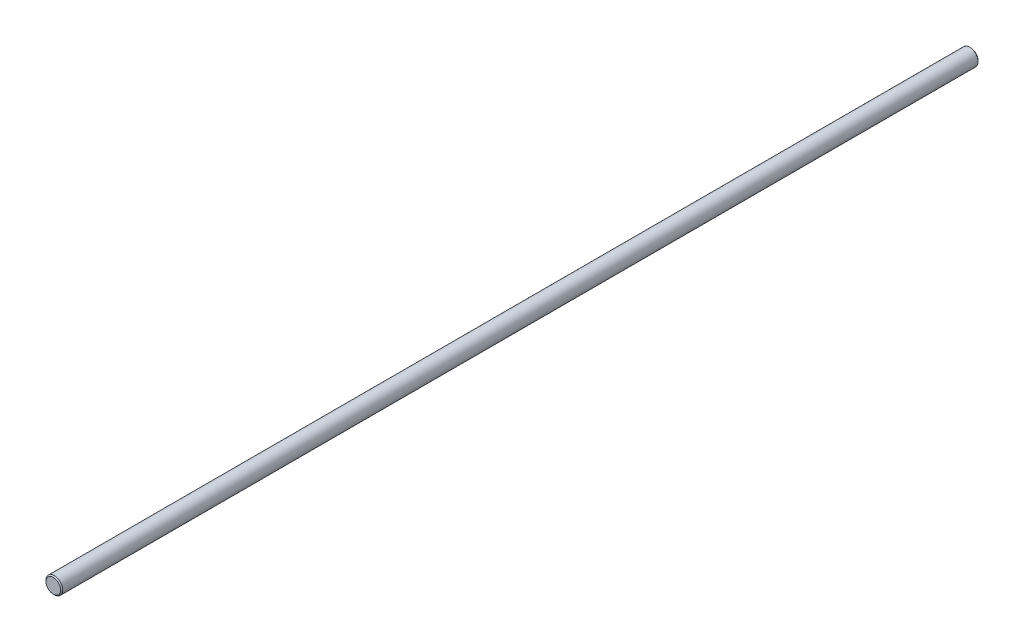
ISO-10303-21;
HEADER;
FILE_DESCRIPTION(('STEP AP214'),'2;1');
FILE_NAME('part.step','',(''),(''),'','','');
FILE_SCHEMA(('AUTOMOTIVE_DESIGN { 1 0 10303 214 1 1 1 1 }'));
ENDSEC;
DATA;
#1=APPLICATION_CONTEXT('core data for automotive mechanical design processes');
#2=APPLICATION_PROTOCOL_DEFINITION('international standard','automotive_design',2000,#1);
#3=PRODUCT_CONTEXT('',#1,'mechanical');
#4=PRODUCT('Part','Part','',(#3));
#5=PRODUCT_RELATED_PRODUCT_CATEGORY('part','',(#4));
#6=PRODUCT_DEFINITION_FORMATION('','',#4);
#7=PRODUCT_DEFINITION_CONTEXT('part definition',#1,'design');
#8=PRODUCT_DEFINITION('design','',#6,#7);
#9=PRODUCT_DEFINITION_SHAPE('','',#8);
#10=(LENGTH_UNIT() NAMED_UNIT(*) SI_UNIT(.MILLI.,.METRE.));
#11=(NAMED_UNIT(*) PLANE_ANGLE_UNIT() SI_UNIT($,.RADIAN.));
#12=(NAMED_UNIT(*) SI_UNIT($,.STERADIAN.) SOLID_ANGLE_UNIT());
#13=UNCERTAINTY_MEASURE_WITH_UNIT(LENGTH_MEASURE(1.E-05),#10,'distance_accuracy_value','');
#14=(GEOMETRIC_REPRESENTATION_CONTEXT(3) GLOBAL_UNCERTAINTY_ASSIGNED_CONTEXT((#13)) GLOBAL_UNIT_ASSIGNED_CONTEXT((#10,
#11,#12)) REPRESENTATION_CONTEXT('',''));
#15=CARTESIAN_POINT('',(0.,0.,0.));
#16=DIRECTION('',(0.,0.,1.));
#17=DIRECTION('',(1.,0.,0.));
#18=AXIS2_PLACEMENT_3D('',#15,#16,#17);
#19=CARTESIAN_POINT('',(0.,0.,439.5));
#20=DIRECTION('',(0.,0.,-1.));
#21=DIRECTION('',(-1.,0.,0.));
#22=AXIS2_PLACEMENT_3D('',#19,#20,#21);
#23=CONICAL_SURFACE('',#22,4.,0.785398163397447);
#24=CARTESIAN_POINT('',(0.,0.,440.));
#25=DIRECTION('',(0.,0.,-1.));
#26=DIRECTION('',(-1.,0.,0.));
#27=AXIS2_PLACEMENT_3D('',#24,#25,#26);
#28=CIRCLE('',#27,3.5);
#29=CARTESIAN_POINT('',(-3.5,0.,440.));
#30=VERTEX_POINT('',#29);
#31=EDGE_CURVE('E42',#30,#30,#28,.T.);
#32=ORIENTED_EDGE('',*,*,#31,.T.);
#33=EDGE_LOOP('',(#32));
#34=FACE_BOUND('',#33,.T.);
#35=CARTESIAN_POINT('',(0.,0.,439.5));
#36=DIRECTION('',(0.,0.,-1.));
#37=DIRECTION('',(-1.,0.,0.));
#38=AXIS2_PLACEMENT_3D('',#35,#36,#37);
#39=CIRCLE('',#38,4.);
#40=CARTESIAN_POINT('',(-4.,0.,439.5));
#41=VERTEX_POINT('',#40);
#42=EDGE_CURVE('E10',#41,#41,#39,.T.);
#43=ORIENTED_EDGE('',*,*,#42,.F.);
#44=EDGE_LOOP('',(#43));
#45=FACE_BOUND('',#44,.T.);
#46=ADVANCED_FACE('F28',(#34,#45),#23,.T.);
#47=CARTESIAN_POINT('',(0.,0.,440.));
#48=DIRECTION('',(0.,0.,-1.));
#49=DIRECTION('',(-1.,0.,0.));
#50=AXIS2_PLACEMENT_3D('',#47,#48,#49);
#51=CYLINDRICAL_SURFACE('',#50,4.);
#52=ORIENTED_EDGE('',*,*,#42,.T.);
#53=EDGE_LOOP('',(#52));
#54=FACE_BOUND('',#53,.T.);
#55=CARTESIAN_POINT('',(0.,0.,0.5));
#56=DIRECTION('',(0.,0.,-1.));
#57=DIRECTION('',(-1.,0.,0.));
#58=AXIS2_PLACEMENT_3D('',#55,#56,#57);
#59=CIRCLE('',#58,4.);
#60=CARTESIAN_POINT('',(-4.,0.,0.5));
#61=VERTEX_POINT('',#60);
#62=EDGE_CURVE('E34',#61,#61,#59,.T.);
#63=ORIENTED_EDGE('',*,*,#62,.F.);
#64=EDGE_LOOP('',(#63));
#65=FACE_BOUND('',#64,.T.);
#66=ADVANCED_FACE('F61',(#54,#65),#51,.T.);
#67=CARTESIAN_POINT('',(0.,0.,0.));
#68=DIRECTION('',(0.,0.,1.));
#69=DIRECTION('',(1.,0.,0.));
#70=AXIS2_PLACEMENT_3D('',#67,#68,#69);
#71=CONICAL_SURFACE('',#70,3.5,0.785398163397448);
#72=ORIENTED_EDGE('',*,*,#62,.T.);
#73=EDGE_LOOP('',(#72));
#74=FACE_BOUND('',#73,.T.);
#75=CARTESIAN_POINT('',(0.,0.,0.));
#76=DIRECTION('',(0.,0.,-1.));
#77=DIRECTION('',(-1.,0.,0.));
#78=AXIS2_PLACEMENT_3D('',#75,#76,#77);
#79=CIRCLE('',#78,3.5);
#80=CARTESIAN_POINT('',(-3.5,0.,0.));
#81=VERTEX_POINT('',#80);
#82=EDGE_CURVE('E38',#81,#81,#79,.T.);
#83=ORIENTED_EDGE('',*,*,#82,.F.);
#84=EDGE_LOOP('',(#83));
#85=FACE_BOUND('',#84,.T.);
#86=ADVANCED_FACE('F57',(#74,#85),#71,.T.);
#87=CARTESIAN_POINT('',(0.,0.,0.));
#88=DIRECTION('',(0.,0.,-1.));
#89=DIRECTION('',(-1.,0.,0.));
#90=AXIS2_PLACEMENT_3D('',#87,#88,#89);
#91=PLANE('',#90);
#92=ORIENTED_EDGE('',*,*,#82,.T.);
#93=EDGE_LOOP('',(#92));
#94=FACE_BOUND('',#93,.T.);
#95=ADVANCED_FACE('F52',(#94),#91,.T.);
#96=CARTESIAN_POINT('',(3.5,0.,440.));
#97=DIRECTION('',(0.,0.,1.));
#98=DIRECTION('',(1.,0.,0.));
#99=AXIS2_PLACEMENT_3D('',#96,#97,#98);
#100=PLANE('',#99);
#101=ORIENTED_EDGE('',*,*,#31,.F.);
#102=EDGE_LOOP('',(#101));
#103=FACE_BOUND('',#102,.T.);
#104=ADVANCED_FACE('F50',(#103),#100,.T.);
#105=CLOSED_SHELL('',(#46,#66,#86,#95,#104));
#106=MANIFOLD_SOLID_BREP('B2',#105);
#107=ADVANCED_BREP_SHAPE_REPRESENTATION('',(#18,#106),#14);
#108=SHAPE_DEFINITION_REPRESENTATION(#9,#107);
ENDSEC;
END-ISO-10303-21;
